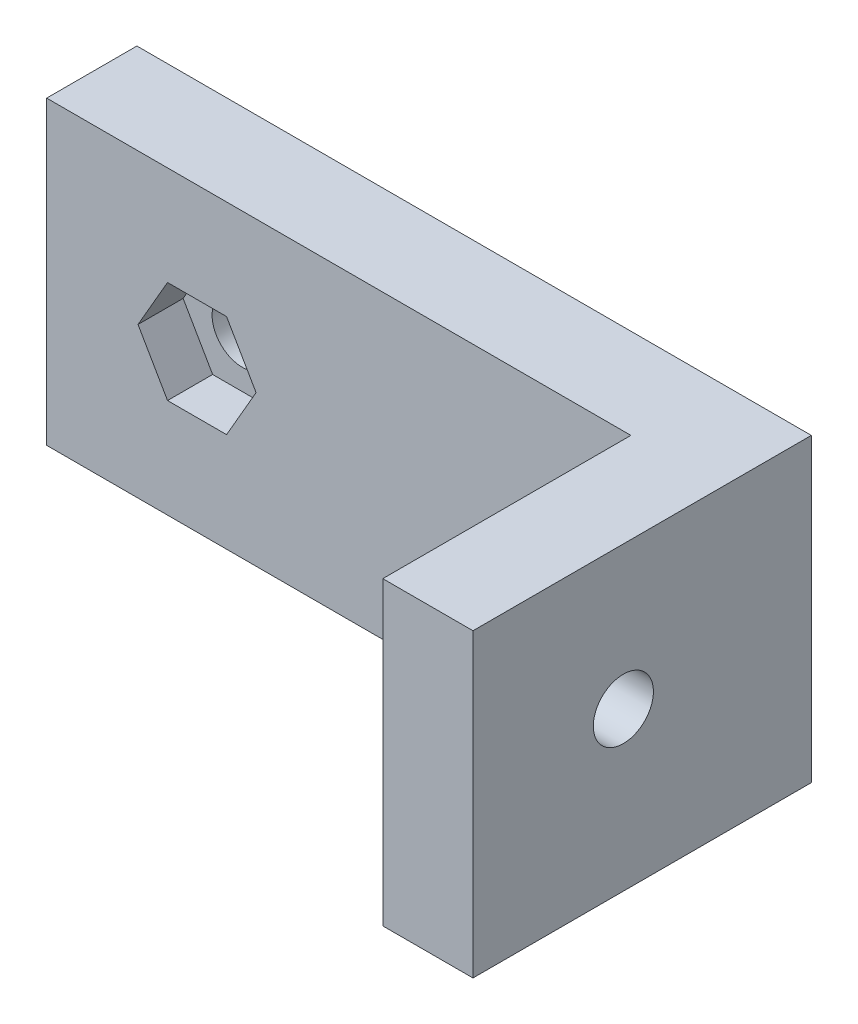
ISO-10303-21;
HEADER;
FILE_DESCRIPTION(('STEP AP214'),'2;1');
FILE_NAME('part.step','',(''),(''),'','','');
FILE_SCHEMA(('AUTOMOTIVE_DESIGN { 1 0 10303 214 1 1 1 1 }'));
ENDSEC;
DATA;
#1=APPLICATION_CONTEXT('core data for automotive mechanical design processes');
#2=APPLICATION_PROTOCOL_DEFINITION('international standard','automotive_design',2000,#1);
#3=PRODUCT_CONTEXT('',#1,'mechanical');
#4=PRODUCT('Part','Part','',(#3));
#5=PRODUCT_RELATED_PRODUCT_CATEGORY('part','',(#4));
#6=PRODUCT_DEFINITION_FORMATION('','',#4);
#7=PRODUCT_DEFINITION_CONTEXT('part definition',#1,'design');
#8=PRODUCT_DEFINITION('design','',#6,#7);
#9=PRODUCT_DEFINITION_SHAPE('','',#8);
#10=(LENGTH_UNIT() NAMED_UNIT(*) SI_UNIT(.MILLI.,.METRE.));
#11=(NAMED_UNIT(*) PLANE_ANGLE_UNIT() SI_UNIT($,.RADIAN.));
#12=(NAMED_UNIT(*) SI_UNIT($,.STERADIAN.) SOLID_ANGLE_UNIT());
#13=UNCERTAINTY_MEASURE_WITH_UNIT(LENGTH_MEASURE(1.E-05),#10,'distance_accuracy_value','');
#14=(GEOMETRIC_REPRESENTATION_CONTEXT(3) GLOBAL_UNCERTAINTY_ASSIGNED_CONTEXT((#13)) GLOBAL_UNIT_ASSIGNED_CONTEXT((#10,
#11,#12)) REPRESENTATION_CONTEXT('',''));
#15=CARTESIAN_POINT('',(0.,0.,0.));
#16=DIRECTION('',(0.,0.,1.));
#17=DIRECTION('',(1.,0.,0.));
#18=AXIS2_PLACEMENT_3D('',#15,#16,#17);
#19=CARTESIAN_POINT('',(166.699999999995,-1.0859269598204E-13,0.));
#20=DIRECTION('',(-1.,0.,0.));
#21=DIRECTION('',(0.,-1.,0.));
#22=AXIS2_PLACEMENT_3D('',#19,#20,#21);
#23=PLANE('',#22);
#24=CARTESIAN_POINT('',(166.699999999995,2.99999999999889,12.5000000000006));
#25=DIRECTION('',(-1.,0.,0.));
#26=DIRECTION('',(0.,-1.,0.));
#27=AXIS2_PLACEMENT_3D('',#24,#25,#26);
#28=CIRCLE('',#27,2.);
#29=CARTESIAN_POINT('',(166.699999999995,0.999999999998898,12.5000000000006));
#30=VERTEX_POINT('',#29);
#31=EDGE_CURVE('E291',#30,#30,#28,.F.);
#32=ORIENTED_EDGE('',*,*,#31,.T.);
#33=EDGE_LOOP('',(#32));
#34=FACE_BOUND('',#33,.T.);
#35=DIRECTION('',(0.,1.,0.));
#36=VECTOR('',#35,1.);
#37=CARTESIAN_POINT('',(166.699999999995,-1.0859269598204E-13,9.10000000000063));
#38=LINE('',#37,#36);
#39=CARTESIAN_POINT('',(166.699999999995,1.03700908475416,9.10000000000063));
#40=VERTEX_POINT('',#39);
#41=CARTESIAN_POINT('',(166.699999999995,4.96299091524362,9.10000000000063));
#42=VERTEX_POINT('',#41);
#43=EDGE_CURVE('E261',#40,#42,#38,.T.);
#44=ORIENTED_EDGE('',*,*,#43,.F.);
#45=DIRECTION('',(0.,0.5,-0.866025403784439));
#46=VECTOR('',#45,1.);
#47=CARTESIAN_POINT('',(166.699999999995,4.71817240078511,2.72403810567631));
#48=LINE('',#47,#46);
#49=CARTESIAN_POINT('',(166.699999999995,-0.925981830490564,12.5000000000006));
#50=VERTEX_POINT('',#49);
#51=EDGE_CURVE('E228',#50,#40,#48,.T.);
#52=ORIENTED_EDGE('',*,*,#51,.F.);
#53=DIRECTION('',(0.,-0.5,-0.866025403784439));
#54=VECTOR('',#53,1.);
#55=CARTESIAN_POINT('',(166.699999999995,-6.10714514652101,3.52596189432386));
#56=LINE('',#55,#54);
#57=CARTESIAN_POINT('',(166.699999999995,1.03700908475417,15.9000000000006));
#58=VERTEX_POINT('',#57);
#59=EDGE_CURVE('E247',#58,#50,#56,.T.);
#60=ORIENTED_EDGE('',*,*,#59,.F.);
#61=DIRECTION('',(0.,-1.,0.));
#62=VECTOR('',#61,1.);
#63=CARTESIAN_POINT('',(166.699999999995,-1.0859269598204E-13,15.9000000000006));
#64=LINE('',#63,#62);
#65=CARTESIAN_POINT('',(166.699999999995,4.96299091524362,15.9000000000006));
#66=VERTEX_POINT('',#65);
#67=EDGE_CURVE('E250',#66,#58,#64,.T.);
#68=ORIENTED_EDGE('',*,*,#67,.F.);
#69=DIRECTION('',(0.,-0.5,0.866025403784439));
#70=VECTOR('',#69,1.);
#71=CARTESIAN_POINT('',(166.699999999995,10.6071451465193,6.12403810567632));
#72=LINE('',#71,#70);
#73=CARTESIAN_POINT('',(166.699999999995,6.92598183048835,12.5000000000006));
#74=VERTEX_POINT('',#73);
#75=EDGE_CURVE('E266',#74,#66,#72,.T.);
#76=ORIENTED_EDGE('',*,*,#75,.F.);
#77=DIRECTION('',(0.,0.5,0.866025403784439));
#78=VECTOR('',#77,1.);
#79=CARTESIAN_POINT('',(166.699999999995,-0.218172400786824,0.125961894323861));
#80=LINE('',#79,#78);
#81=EDGE_CURVE('E263',#42,#74,#80,.T.);
#82=ORIENTED_EDGE('',*,*,#81,.F.);
#83=EDGE_LOOP('',(#44,#52,#60,#68,#76,#82));
#84=FACE_BOUND('',#83,.T.);
#85=ADVANCED_FACE('F97',(#34,#84),#23,.T.);
#86=CARTESIAN_POINT('',(0.,0.,6.));
#87=DIRECTION('',(0.,0.,1.));
#88=DIRECTION('',(1.,0.,0.));
#89=AXIS2_PLACEMENT_3D('',#86,#87,#88);
#90=PLANE('',#89);
#91=DIRECTION('',(0.,-1.,0.));
#92=VECTOR('',#91,1.);
#93=CARTESIAN_POINT('',(163.699999999995,-1.06549720020236E-13,6.));
#94=LINE('',#93,#92);
#95=CARTESIAN_POINT('',(163.699999999995,12.5000000000001,6.));
#96=VERTEX_POINT('',#95);
#97=CARTESIAN_POINT('',(163.699999999995,-7.49999999999993,6.));
#98=VERTEX_POINT('',#97);
#99=EDGE_CURVE('E116',#96,#98,#94,.T.);
#100=ORIENTED_EDGE('',*,*,#99,.F.);
#101=DIRECTION('',(1.,0.,0.));
#102=VECTOR('',#101,1.);
#103=CARTESIAN_POINT('',(0.,12.5,6.));
#104=LINE('',#103,#102);
#105=CARTESIAN_POINT('',(124.850000000005,12.5000000000001,6.));
#106=VERTEX_POINT('',#105);
#107=EDGE_CURVE('E362',#106,#96,#104,.T.);
#108=ORIENTED_EDGE('',*,*,#107,.F.);
#109=DIRECTION('',(0.,-1.,0.));
#110=VECTOR('',#109,1.);
#111=CARTESIAN_POINT('',(124.850000000005,0.,6.));
#112=LINE('',#111,#110);
#113=CARTESIAN_POINT('',(124.850000000005,-7.49999999999993,6.));
#114=VERTEX_POINT('',#113);
#115=EDGE_CURVE('E360',#106,#114,#112,.T.);
#116=ORIENTED_EDGE('',*,*,#115,.T.);
#117=DIRECTION('',(1.,0.,0.));
#118=VECTOR('',#117,1.);
#119=CARTESIAN_POINT('',(0.,-7.49999999999996,6.));
#120=LINE('',#119,#118);
#121=EDGE_CURVE('E112',#114,#98,#120,.T.);
#122=ORIENTED_EDGE('',*,*,#121,.T.);
#123=EDGE_LOOP('',(#100,#108,#116,#122));
#124=FACE_BOUND('',#123,.T.);
#125=DIRECTION('',(0.499999999999999,0.866025403784439,0.));
#126=VECTOR('',#125,1.);
#127=CARTESIAN_POINT('',(97.1104818724058,-56.0667628501677,6.));
#128=LINE('',#127,#126);
#129=CARTESIAN_POINT('',(130.924018169515,2.50000000000006,6.));
#130=VERTEX_POINT('',#129);
#131=CARTESIAN_POINT('',(132.88700908476,5.90000000000007,6.));
#132=VERTEX_POINT('',#131);
#133=EDGE_CURVE('E306',#130,#132,#128,.T.);
#134=ORIENTED_EDGE('',*,*,#133,.T.);
#135=DIRECTION('',(1.,0.,0.));
#136=VECTOR('',#135,1.);
#137=CARTESIAN_POINT('',(0.,5.90000000000007,6.));
#138=LINE('',#137,#136);
#139=CARTESIAN_POINT('',(136.812990915249,5.90000000000007,6.));
#140=VERTEX_POINT('',#139);
#141=EDGE_CURVE('E309',#132,#140,#138,.T.);
#142=ORIENTED_EDGE('',*,*,#141,.T.);
#143=DIRECTION('',(0.500000000000001,-0.866025403784438,0.));
#144=VECTOR('',#143,1.);
#145=CARTESIAN_POINT('',(105.164518127601,60.7167628501678,6.));
#146=LINE('',#145,#144);
#147=CARTESIAN_POINT('',(138.775981830494,2.50000000000005,6.));
#148=VERTEX_POINT('',#147);
#149=EDGE_CURVE('E313',#140,#148,#146,.T.);
#150=ORIENTED_EDGE('',*,*,#149,.T.);
#151=DIRECTION('',(-0.500000000000003,-0.866025403784437,0.));
#152=VECTOR('',#151,1.);
#153=CARTESIAN_POINT('',(102.999454618139,-59.466762850168,6.));
#154=LINE('',#153,#152);
#155=CARTESIAN_POINT('',(136.812990915249,-0.89999999999993,6.));
#156=VERTEX_POINT('',#155);
#157=EDGE_CURVE('E316',#148,#156,#154,.T.);
#158=ORIENTED_EDGE('',*,*,#157,.T.);
#159=DIRECTION('',(-1.,0.,0.));
#160=VECTOR('',#159,1.);
#161=CARTESIAN_POINT('',(0.,-0.899999999999915,6.));
#162=LINE('',#161,#160);
#163=CARTESIAN_POINT('',(132.88700908476,-0.899999999999929,6.));
#164=VERTEX_POINT('',#163);
#165=EDGE_CURVE('E319',#156,#164,#162,.T.);
#166=ORIENTED_EDGE('',*,*,#165,.T.);
#167=DIRECTION('',(-0.499999999999994,0.866025403784442,0.));
#168=VECTOR('',#167,1.);
#169=CARTESIAN_POINT('',(99.2755453818676,57.3167628501673,6.));
#170=LINE('',#169,#168);
#171=EDGE_CURVE('E322',#164,#130,#170,.T.);
#172=ORIENTED_EDGE('',*,*,#171,.T.);
#173=EDGE_LOOP('',(#134,#142,#150,#158,#166,#172));
#174=FACE_BOUND('',#173,.T.);
#175=ADVANCED_FACE('F420',(#124,#174),#90,.T.);
#176=CARTESIAN_POINT('',(124.850000000005,0.,3.));
#177=DIRECTION('',(-1.,0.,0.));
#178=DIRECTION('',(0.,0.,1.));
#179=AXIS2_PLACEMENT_3D('',#176,#177,#178);
#180=PLANE('',#179);
#181=DIRECTION('',(0.,1.,0.));
#182=VECTOR('',#181,1.);
#183=CARTESIAN_POINT('',(124.850000000005,0.,0.));
#184=LINE('',#183,#182);
#185=CARTESIAN_POINT('',(124.850000000005,-7.49999999999993,0.));
#186=VERTEX_POINT('',#185);
#187=CARTESIAN_POINT('',(124.850000000005,12.5000000000001,0.));
#188=VERTEX_POINT('',#187);
#189=EDGE_CURVE('E364',#186,#188,#184,.T.);
#190=ORIENTED_EDGE('',*,*,#189,.F.);
#191=DIRECTION('',(0.,0.,-1.));
#192=VECTOR('',#191,1.);
#193=CARTESIAN_POINT('',(124.850000000005,-7.49999999999993,3.));
#194=LINE('',#193,#192);
#195=EDGE_CURVE('E12',#114,#186,#194,.T.);
#196=ORIENTED_EDGE('',*,*,#195,.F.);
#197=ORIENTED_EDGE('',*,*,#115,.F.);
#198=DIRECTION('',(0.,0.,-1.));
#199=VECTOR('',#198,1.);
#200=CARTESIAN_POINT('',(124.850000000005,12.5000000000001,3.));
#201=LINE('',#200,#199);
#202=EDGE_CURVE('E368',#106,#188,#201,.T.);
#203=ORIENTED_EDGE('',*,*,#202,.T.);
#204=EDGE_LOOP('',(#190,#196,#197,#203));
#205=FACE_BOUND('',#204,.T.);
#206=ADVANCED_FACE('F99',(#205),#180,.T.);
#207=CARTESIAN_POINT('',(0.,-7.49999999999996,3.));
#208=DIRECTION('',(0.,-1.,0.));
#209=DIRECTION('',(1.,0.,0.));
#210=AXIS2_PLACEMENT_3D('',#207,#208,#209);
#211=PLANE('',#210);
#212=DIRECTION('',(-1.,0.,0.));
#213=VECTOR('',#212,1.);
#214=CARTESIAN_POINT('',(0.,-7.49999999999996,0.));
#215=LINE('',#214,#213);
#216=CARTESIAN_POINT('',(169.699999999995,-7.49999999999992,0.));
#217=VERTEX_POINT('',#216);
#218=EDGE_CURVE('E372',#217,#186,#215,.T.);
#219=ORIENTED_EDGE('',*,*,#218,.F.);
#220=DIRECTION('',(0.,0.,-1.));
#221=VECTOR('',#220,1.);
#222=CARTESIAN_POINT('',(169.699999999995,-7.49999999999992,3.));
#223=LINE('',#222,#221);
#224=CARTESIAN_POINT('',(169.699999999995,-7.49999999999991,22.5000000000006));
#225=VERTEX_POINT('',#224);
#226=EDGE_CURVE('E105',#225,#217,#223,.T.);
#227=ORIENTED_EDGE('',*,*,#226,.F.);
#228=DIRECTION('',(1.,0.,0.));
#229=VECTOR('',#228,1.);
#230=CARTESIAN_POINT('',(166.699999999995,-7.49999999999991,22.5000000000006));
#231=LINE('',#230,#229);
#232=CARTESIAN_POINT('',(163.699999999995,-7.49999999999991,22.5000000000006));
#233=VERTEX_POINT('',#232);
#234=EDGE_CURVE('E302',#233,#225,#231,.T.);
#235=ORIENTED_EDGE('',*,*,#234,.F.);
#236=DIRECTION('',(0.,0.,-1.));
#237=VECTOR('',#236,1.);
#238=CARTESIAN_POINT('',(163.699999999995,-7.49999999999991,0.));
#239=LINE('',#238,#237);
#240=EDGE_CURVE('E284',#233,#98,#239,.T.);
#241=ORIENTED_EDGE('',*,*,#240,.T.);
#242=ORIENTED_EDGE('',*,*,#121,.F.);
#243=ORIENTED_EDGE('',*,*,#195,.T.);
#244=EDGE_LOOP('',(#219,#227,#235,#241,#242,#243));
#245=FACE_BOUND('',#244,.T.);
#246=ADVANCED_FACE('F396',(#245),#211,.T.);
#247=CARTESIAN_POINT('',(169.699999999995,0.,3.));
#248=DIRECTION('',(-1.,0.,0.));
#249=DIRECTION('',(0.,0.,1.));
#250=AXIS2_PLACEMENT_3D('',#247,#248,#249);
#251=PLANE('',#250);
#252=DIRECTION('',(0.,1.,0.));
#253=VECTOR('',#252,1.);
#254=CARTESIAN_POINT('',(169.699999999995,0.,0.));
#255=LINE('',#254,#253);
#256=CARTESIAN_POINT('',(169.699999999995,12.5000000000001,0.));
#257=VERTEX_POINT('',#256);
#258=EDGE_CURVE('E375',#217,#257,#255,.T.);
#259=ORIENTED_EDGE('',*,*,#258,.T.);
#260=DIRECTION('',(0.,0.,-1.));
#261=VECTOR('',#260,1.);
#262=CARTESIAN_POINT('',(169.699999999995,12.5000000000001,3.));
#263=LINE('',#262,#261);
#264=CARTESIAN_POINT('',(169.699999999995,12.5000000000001,22.5000000000006));
#265=VERTEX_POINT('',#264);
#266=EDGE_CURVE('E383',#265,#257,#263,.T.);
#267=ORIENTED_EDGE('',*,*,#266,.F.);
#268=DIRECTION('',(0.,1.,0.));
#269=VECTOR('',#268,1.);
#270=CARTESIAN_POINT('',(169.699999999995,-1.10635671943845E-13,22.5000000000006));
#271=LINE('',#270,#269);
#272=EDGE_CURVE('E290',#225,#265,#271,.T.);
#273=ORIENTED_EDGE('',*,*,#272,.F.);
#274=ORIENTED_EDGE('',*,*,#226,.T.);
#275=EDGE_LOOP('',(#259,#267,#273,#274));
#276=FACE_BOUND('',#275,.T.);
#277=CARTESIAN_POINT('',(169.699999999995,2.99999999999889,12.5000000000006));
#278=DIRECTION('',(-1.,0.,0.));
#279=DIRECTION('',(0.,-1.,0.));
#280=AXIS2_PLACEMENT_3D('',#277,#278,#279);
#281=CIRCLE('',#280,2.);
#282=CARTESIAN_POINT('',(169.699999999995,0.999999999998896,12.5000000000006));
#283=VERTEX_POINT('',#282);
#284=EDGE_CURVE('E295',#283,#283,#281,.F.);
#285=ORIENTED_EDGE('',*,*,#284,.F.);
#286=EDGE_LOOP('',(#285));
#287=FACE_BOUND('',#286,.T.);
#288=ADVANCED_FACE('F388',(#276,#287),#251,.F.);
#289=CARTESIAN_POINT('',(0.,12.5,3.));
#290=DIRECTION('',(0.,-1.,0.));
#291=DIRECTION('',(1.,0.,0.));
#292=AXIS2_PLACEMENT_3D('',#289,#290,#291);
#293=PLANE('',#292);
#294=DIRECTION('',(-1.,0.,0.));
#295=VECTOR('',#294,1.);
#296=CARTESIAN_POINT('',(0.,12.5,0.));
#297=LINE('',#296,#295);
#298=EDGE_CURVE('E377',#257,#188,#297,.T.);
#299=ORIENTED_EDGE('',*,*,#298,.T.);
#300=ORIENTED_EDGE('',*,*,#202,.F.);
#301=ORIENTED_EDGE('',*,*,#107,.T.);
#302=DIRECTION('',(0.,0.,-1.));
#303=VECTOR('',#302,1.);
#304=CARTESIAN_POINT('',(163.699999999995,12.5000000000001,0.));
#305=LINE('',#304,#303);
#306=CARTESIAN_POINT('',(163.699999999995,12.5000000000001,22.5000000000006));
#307=VERTEX_POINT('',#306);
#308=EDGE_CURVE('E273',#307,#96,#305,.T.);
#309=ORIENTED_EDGE('',*,*,#308,.F.);
#310=DIRECTION('',(1.,0.,0.));
#311=VECTOR('',#310,1.);
#312=CARTESIAN_POINT('',(166.699999999995,12.5000000000001,22.5000000000006));
#313=LINE('',#312,#311);
#314=EDGE_CURVE('E294',#307,#265,#313,.T.);
#315=ORIENTED_EDGE('',*,*,#314,.T.);
#316=ORIENTED_EDGE('',*,*,#266,.T.);
#317=EDGE_LOOP('',(#299,#300,#301,#309,#315,#316));
#318=FACE_BOUND('',#317,.T.);
#319=ADVANCED_FACE('F401',(#318),#293,.F.);
#320=CARTESIAN_POINT('',(134.850000000005,2.50000000000007,3.));
#321=DIRECTION('',(0.,0.,-1.));
#322=DIRECTION('',(-1.,0.,0.));
#323=AXIS2_PLACEMENT_3D('',#320,#321,#322);
#324=CYLINDRICAL_SURFACE('',#323,2.);
#325=CARTESIAN_POINT('',(134.850000000005,2.50000000000007,3.));
#326=DIRECTION('',(0.,0.,1.));
#327=DIRECTION('',(1.,0.,0.));
#328=AXIS2_PLACEMENT_3D('',#325,#326,#327);
#329=CIRCLE('',#328,2.);
#330=CARTESIAN_POINT('',(136.850000000005,2.50000000000007,3.));
#331=VERTEX_POINT('',#330);
#332=EDGE_CURVE('E365',#331,#331,#329,.T.);
#333=ORIENTED_EDGE('',*,*,#332,.T.);
#334=EDGE_LOOP('',(#333));
#335=FACE_BOUND('',#334,.T.);
#336=CARTESIAN_POINT('',(134.850000000005,2.50000000000007,0.));
#337=DIRECTION('',(0.,0.,1.));
#338=DIRECTION('',(1.,0.,0.));
#339=AXIS2_PLACEMENT_3D('',#336,#337,#338);
#340=CIRCLE('',#339,2.);
#341=CARTESIAN_POINT('',(136.850000000005,2.50000000000007,0.));
#342=VERTEX_POINT('',#341);
#343=EDGE_CURVE('E369',#342,#342,#340,.T.);
#344=ORIENTED_EDGE('',*,*,#343,.F.);
#345=EDGE_LOOP('',(#344));
#346=FACE_BOUND('',#345,.T.);
#347=ADVANCED_FACE('F457',(#335,#346),#324,.F.);
#348=CARTESIAN_POINT('',(0.,0.,3.));
#349=DIRECTION('',(0.,0.,1.));
#350=DIRECTION('',(1.,0.,0.));
#351=AXIS2_PLACEMENT_3D('',#348,#349,#350);
#352=PLANE('',#351);
#353=DIRECTION('',(1.,0.,0.));
#354=VECTOR('',#353,1.);
#355=CARTESIAN_POINT('',(0.,5.90000000000007,3.));
#356=LINE('',#355,#354);
#357=CARTESIAN_POINT('',(132.88700908476,5.90000000000007,3.));
#358=VERTEX_POINT('',#357);
#359=CARTESIAN_POINT('',(136.812990915249,5.90000000000004,3.));
#360=VERTEX_POINT('',#359);
#361=EDGE_CURVE('E328',#358,#360,#356,.T.);
#362=ORIENTED_EDGE('',*,*,#361,.F.);
#363=DIRECTION('',(0.499999999999999,0.866025403784439,0.));
#364=VECTOR('',#363,1.);
#365=CARTESIAN_POINT('',(97.1104818724058,-56.0667628501677,3.));
#366=LINE('',#365,#364);
#367=CARTESIAN_POINT('',(130.924018169515,2.50000000000006,3.));
#368=VERTEX_POINT('',#367);
#369=EDGE_CURVE('E305',#368,#358,#366,.T.);
#370=ORIENTED_EDGE('',*,*,#369,.F.);
#371=DIRECTION('',(-0.499999999999994,0.866025403784442,0.));
#372=VECTOR('',#371,1.);
#373=CARTESIAN_POINT('',(99.2755453818676,57.3167628501673,3.));
#374=LINE('',#373,#372);
#375=CARTESIAN_POINT('',(132.88700908476,-0.899999999999929,3.));
#376=VERTEX_POINT('',#375);
#377=EDGE_CURVE('E310',#376,#368,#374,.T.);
#378=ORIENTED_EDGE('',*,*,#377,.F.);
#379=DIRECTION('',(-1.,0.,0.));
#380=VECTOR('',#379,1.);
#381=CARTESIAN_POINT('',(0.,-0.899999999999915,3.));
#382=LINE('',#381,#380);
#383=CARTESIAN_POINT('',(136.812990915249,-0.89999999999993,3.));
#384=VERTEX_POINT('',#383);
#385=EDGE_CURVE('E337',#384,#376,#382,.T.);
#386=ORIENTED_EDGE('',*,*,#385,.F.);
#387=DIRECTION('',(-0.500000000000003,-0.866025403784437,0.));
#388=VECTOR('',#387,1.);
#389=CARTESIAN_POINT('',(102.999454618139,-59.466762850168,3.));
#390=LINE('',#389,#388);
#391=CARTESIAN_POINT('',(138.775981830494,2.50000000000005,3.));
#392=VERTEX_POINT('',#391);
#393=EDGE_CURVE('E334',#392,#384,#390,.T.);
#394=ORIENTED_EDGE('',*,*,#393,.F.);
#395=DIRECTION('',(0.500000000000001,-0.866025403784438,0.));
#396=VECTOR('',#395,1.);
#397=CARTESIAN_POINT('',(105.164518127601,60.7167628501678,3.));
#398=LINE('',#397,#396);
#399=EDGE_CURVE('E331',#360,#392,#398,.T.);
#400=ORIENTED_EDGE('',*,*,#399,.F.);
#401=EDGE_LOOP('',(#362,#370,#378,#386,#394,#400));
#402=FACE_BOUND('',#401,.T.);
#403=ORIENTED_EDGE('',*,*,#332,.F.);
#404=EDGE_LOOP('',(#403));
#405=FACE_BOUND('',#404,.T.);
#406=ADVANCED_FACE('F454',(#402,#405),#352,.T.);
#407=CARTESIAN_POINT('',(0.,0.,0.));
#408=DIRECTION('',(0.,0.,1.));
#409=DIRECTION('',(1.,0.,0.));
#410=AXIS2_PLACEMENT_3D('',#407,#408,#409);
#411=PLANE('',#410);
#412=ORIENTED_EDGE('',*,*,#189,.T.);
#413=ORIENTED_EDGE('',*,*,#298,.F.);
#414=ORIENTED_EDGE('',*,*,#258,.F.);
#415=ORIENTED_EDGE('',*,*,#218,.T.);
#416=EDGE_LOOP('',(#412,#413,#414,#415));
#417=FACE_BOUND('',#416,.T.);
#418=ORIENTED_EDGE('',*,*,#343,.T.);
#419=EDGE_LOOP('',(#418));
#420=FACE_BOUND('',#419,.T.);
#421=ADVANCED_FACE('F394',(#417,#420),#411,.F.);
#422=CARTESIAN_POINT('',(97.1104818724058,-56.0667628501677,6.));
#423=DIRECTION('',(-0.866025403784439,0.499999999999999,0.));
#424=DIRECTION('',(-0.499999999999999,-0.866025403784439,0.));
#425=AXIS2_PLACEMENT_3D('',#422,#423,#424);
#426=PLANE('',#425);
#427=ORIENTED_EDGE('',*,*,#369,.T.);
#428=DIRECTION('',(0.,0.,-1.));
#429=VECTOR('',#428,1.);
#430=CARTESIAN_POINT('',(132.88700908476,5.90000000000007,6.));
#431=LINE('',#430,#429);
#432=EDGE_CURVE('E325',#132,#358,#431,.T.);
#433=ORIENTED_EDGE('',*,*,#432,.F.);
#434=ORIENTED_EDGE('',*,*,#133,.F.);
#435=DIRECTION('',(0.,0.,-1.));
#436=VECTOR('',#435,1.);
#437=CARTESIAN_POINT('',(130.924018169515,2.50000000000006,6.));
#438=LINE('',#437,#436);
#439=EDGE_CURVE('E342',#130,#368,#438,.T.);
#440=ORIENTED_EDGE('',*,*,#439,.T.);
#441=EDGE_LOOP('',(#427,#433,#434,#440));
#442=FACE_BOUND('',#441,.T.);
#443=ADVANCED_FACE('F435',(#442),#426,.F.);
#444=CARTESIAN_POINT('',(99.2755453818676,57.3167628501673,6.));
#445=DIRECTION('',(-0.866025403784442,-0.499999999999994,0.));
#446=DIRECTION('',(0.499999999999994,-0.866025403784442,0.));
#447=AXIS2_PLACEMENT_3D('',#444,#445,#446);
#448=PLANE('',#447);
#449=ORIENTED_EDGE('',*,*,#377,.T.);
#450=ORIENTED_EDGE('',*,*,#439,.F.);
#451=ORIENTED_EDGE('',*,*,#171,.F.);
#452=DIRECTION('',(0.,0.,-1.));
#453=VECTOR('',#452,1.);
#454=CARTESIAN_POINT('',(132.88700908476,-0.899999999999929,6.));
#455=LINE('',#454,#453);
#456=EDGE_CURVE('E345',#164,#376,#455,.T.);
#457=ORIENTED_EDGE('',*,*,#456,.T.);
#458=EDGE_LOOP('',(#449,#450,#451,#457));
#459=FACE_BOUND('',#458,.T.);
#460=ADVANCED_FACE('F431',(#459),#448,.F.);
#461=CARTESIAN_POINT('',(0.,-0.899999999999915,6.));
#462=DIRECTION('',(0.,-1.,0.));
#463=DIRECTION('',(1.,0.,0.));
#464=AXIS2_PLACEMENT_3D('',#461,#462,#463);
#465=PLANE('',#464);
#466=ORIENTED_EDGE('',*,*,#385,.T.);
#467=ORIENTED_EDGE('',*,*,#456,.F.);
#468=ORIENTED_EDGE('',*,*,#165,.F.);
#469=DIRECTION('',(0.,0.,-1.));
#470=VECTOR('',#469,1.);
#471=CARTESIAN_POINT('',(136.812990915249,-0.89999999999993,6.));
#472=LINE('',#471,#470);
#473=EDGE_CURVE('E348',#156,#384,#472,.T.);
#474=ORIENTED_EDGE('',*,*,#473,.T.);
#475=EDGE_LOOP('',(#466,#467,#468,#474));
#476=FACE_BOUND('',#475,.T.);
#477=ADVANCED_FACE('F434',(#476),#465,.F.);
#478=CARTESIAN_POINT('',(102.999454618139,-59.466762850168,6.));
#479=DIRECTION('',(0.866025403784437,-0.500000000000003,0.));
#480=DIRECTION('',(0.500000000000004,0.866025403784437,0.));
#481=AXIS2_PLACEMENT_3D('',#478,#479,#480);
#482=PLANE('',#481);
#483=ORIENTED_EDGE('',*,*,#393,.T.);
#484=ORIENTED_EDGE('',*,*,#473,.F.);
#485=ORIENTED_EDGE('',*,*,#157,.F.);
#486=DIRECTION('',(0.,0.,-1.));
#487=VECTOR('',#486,1.);
#488=CARTESIAN_POINT('',(138.775981830494,2.50000000000005,6.));
#489=LINE('',#488,#487);
#490=EDGE_CURVE('E351',#148,#392,#489,.T.);
#491=ORIENTED_EDGE('',*,*,#490,.T.);
#492=EDGE_LOOP('',(#483,#484,#485,#491));
#493=FACE_BOUND('',#492,.T.);
#494=ADVANCED_FACE('F439',(#493),#482,.F.);
#495=CARTESIAN_POINT('',(105.164518127601,60.7167628501678,6.));
#496=DIRECTION('',(0.866025403784438,0.500000000000001,0.));
#497=DIRECTION('',(-0.500000000000001,0.866025403784438,0.));
#498=AXIS2_PLACEMENT_3D('',#495,#496,#497);
#499=PLANE('',#498);
#500=ORIENTED_EDGE('',*,*,#399,.T.);
#501=ORIENTED_EDGE('',*,*,#490,.F.);
#502=ORIENTED_EDGE('',*,*,#149,.F.);
#503=DIRECTION('',(0.,0.,-1.));
#504=VECTOR('',#503,1.);
#505=CARTESIAN_POINT('',(136.812990915249,5.90000000000004,6.));
#506=LINE('',#505,#504);
#507=EDGE_CURVE('E354',#140,#360,#506,.T.);
#508=ORIENTED_EDGE('',*,*,#507,.T.);
#509=EDGE_LOOP('',(#500,#501,#502,#508));
#510=FACE_BOUND('',#509,.T.);
#511=ADVANCED_FACE('F443',(#510),#499,.F.);
#512=CARTESIAN_POINT('',(0.,5.90000000000007,6.));
#513=DIRECTION('',(0.,1.,0.));
#514=DIRECTION('',(0.,0.,1.));
#515=AXIS2_PLACEMENT_3D('',#512,#513,#514);
#516=PLANE('',#515);
#517=ORIENTED_EDGE('',*,*,#361,.T.);
#518=ORIENTED_EDGE('',*,*,#507,.F.);
#519=ORIENTED_EDGE('',*,*,#141,.F.);
#520=ORIENTED_EDGE('',*,*,#432,.T.);
#521=EDGE_LOOP('',(#517,#518,#519,#520));
#522=FACE_BOUND('',#521,.T.);
#523=ADVANCED_FACE('F430',(#522),#516,.F.);
#524=CARTESIAN_POINT('',(166.699999999995,-1.0859269598204E-13,22.5000000000006));
#525=DIRECTION('',(0.,0.,-1.));
#526=DIRECTION('',(-1.,0.,0.));
#527=AXIS2_PLACEMENT_3D('',#524,#525,#526);
#528=PLANE('',#527);
#529=ORIENTED_EDGE('',*,*,#272,.T.);
#530=ORIENTED_EDGE('',*,*,#314,.F.);
#531=DIRECTION('',(0.,-1.,0.));
#532=VECTOR('',#531,1.);
#533=CARTESIAN_POINT('',(163.699999999995,-1.06549720020236E-13,22.5000000000006));
#534=LINE('',#533,#532);
#535=EDGE_CURVE('E287',#307,#233,#534,.T.);
#536=ORIENTED_EDGE('',*,*,#535,.T.);
#537=ORIENTED_EDGE('',*,*,#234,.T.);
#538=EDGE_LOOP('',(#529,#530,#536,#537));
#539=FACE_BOUND('',#538,.T.);
#540=ADVANCED_FACE('F405',(#539),#528,.F.);
#541=CARTESIAN_POINT('',(166.699999999995,2.99999999999889,12.5000000000006));
#542=DIRECTION('',(1.,0.,0.));
#543=DIRECTION('',(0.,1.,0.));
#544=AXIS2_PLACEMENT_3D('',#541,#542,#543);
#545=CYLINDRICAL_SURFACE('',#544,2.);
#546=ORIENTED_EDGE('',*,*,#31,.F.);
#547=EDGE_LOOP('',(#546));
#548=FACE_BOUND('',#547,.T.);
#549=ORIENTED_EDGE('',*,*,#284,.T.);
#550=EDGE_LOOP('',(#549));
#551=FACE_BOUND('',#550,.T.);
#552=ADVANCED_FACE('F408',(#548,#551),#545,.F.);
#553=CARTESIAN_POINT('',(163.699999999995,-1.06636850278849E-13,0.));
#554=DIRECTION('',(-1.,0.,0.));
#555=DIRECTION('',(0.,-1.,0.));
#556=AXIS2_PLACEMENT_3D('',#553,#554,#555);
#557=PLANE('',#556);
#558=DIRECTION('',(0.,0.5,-0.866025403784439));
#559=VECTOR('',#558,1.);
#560=CARTESIAN_POINT('',(163.699999999995,4.71817240078511,2.72403810567631));
#561=LINE('',#560,#559);
#562=CARTESIAN_POINT('',(163.699999999995,-0.925981830490562,12.5000000000006));
#563=VERTEX_POINT('',#562);
#564=CARTESIAN_POINT('',(163.699999999995,1.03700908475417,9.10000000000063));
#565=VERTEX_POINT('',#564);
#566=EDGE_CURVE('E225',#563,#565,#561,.T.);
#567=ORIENTED_EDGE('',*,*,#566,.T.);
#568=DIRECTION('',(0.,1.,0.));
#569=VECTOR('',#568,1.);
#570=CARTESIAN_POINT('',(163.699999999995,-1.06549720020236E-13,9.10000000000063));
#571=LINE('',#570,#569);
#572=CARTESIAN_POINT('',(163.699999999995,4.96299091524362,9.10000000000063));
#573=VERTEX_POINT('',#572);
#574=EDGE_CURVE('E237',#565,#573,#571,.T.);
#575=ORIENTED_EDGE('',*,*,#574,.T.);
#576=DIRECTION('',(0.,0.5,0.866025403784439));
#577=VECTOR('',#576,1.);
#578=CARTESIAN_POINT('',(163.699999999995,-0.218172400786822,0.125961894323863));
#579=LINE('',#578,#577);
#580=CARTESIAN_POINT('',(163.699999999995,6.92598183048835,12.5000000000006));
#581=VERTEX_POINT('',#580);
#582=EDGE_CURVE('E241',#573,#581,#579,.T.);
#583=ORIENTED_EDGE('',*,*,#582,.T.);
#584=DIRECTION('',(0.,-0.5,0.866025403784439));
#585=VECTOR('',#584,1.);
#586=CARTESIAN_POINT('',(163.699999999995,10.6071451465193,6.12403810567632));
#587=LINE('',#586,#585);
#588=CARTESIAN_POINT('',(163.699999999995,4.96299091524362,15.9000000000006));
#589=VERTEX_POINT('',#588);
#590=EDGE_CURVE('E254',#581,#589,#587,.T.);
#591=ORIENTED_EDGE('',*,*,#590,.T.);
#592=DIRECTION('',(0.,-1.,0.));
#593=VECTOR('',#592,1.);
#594=CARTESIAN_POINT('',(163.699999999995,-1.06549720020236E-13,15.9000000000006));
#595=LINE('',#594,#593);
#596=CARTESIAN_POINT('',(163.699999999995,1.03700908475417,15.9000000000006));
#597=VERTEX_POINT('',#596);
#598=EDGE_CURVE('E257',#589,#597,#595,.T.);
#599=ORIENTED_EDGE('',*,*,#598,.T.);
#600=DIRECTION('',(0.,-0.5,-0.866025403784439));
#601=VECTOR('',#600,1.);
#602=CARTESIAN_POINT('',(163.699999999995,-6.10714514652101,3.52596189432387));
#603=LINE('',#602,#601);
#604=EDGE_CURVE('E233',#597,#563,#603,.T.);
#605=ORIENTED_EDGE('',*,*,#604,.T.);
#606=EDGE_LOOP('',(#567,#575,#583,#591,#599,#605));
#607=FACE_BOUND('',#606,.T.);
#608=ORIENTED_EDGE('',*,*,#308,.T.);
#609=ORIENTED_EDGE('',*,*,#99,.T.);
#610=ORIENTED_EDGE('',*,*,#240,.F.);
#611=ORIENTED_EDGE('',*,*,#535,.F.);
#612=EDGE_LOOP('',(#608,#609,#610,#611));
#613=FACE_BOUND('',#612,.T.);
#614=ADVANCED_FACE('F243',(#607,#613),#557,.T.);
#615=CARTESIAN_POINT('',(163.699999999995,4.71817240078511,2.72403810567631));
#616=DIRECTION('',(0.,-0.866025403784439,-0.5));
#617=DIRECTION('',(0.,0.5,-0.866025403784439));
#618=AXIS2_PLACEMENT_3D('',#615,#616,#617);
#619=PLANE('',#618);
#620=ORIENTED_EDGE('',*,*,#51,.T.);
#621=DIRECTION('',(1.,0.,0.));
#622=VECTOR('',#621,1.);
#623=CARTESIAN_POINT('',(163.699999999995,1.03700908475417,9.10000000000063));
#624=LINE('',#623,#622);
#625=EDGE_CURVE('E221',#565,#40,#624,.T.);
#626=ORIENTED_EDGE('',*,*,#625,.F.);
#627=ORIENTED_EDGE('',*,*,#566,.F.);
#628=DIRECTION('',(1.,0.,0.));
#629=VECTOR('',#628,1.);
#630=CARTESIAN_POINT('',(163.699999999995,-0.925981830490562,12.5000000000006));
#631=LINE('',#630,#629);
#632=EDGE_CURVE('E271',#563,#50,#631,.T.);
#633=ORIENTED_EDGE('',*,*,#632,.T.);
#634=EDGE_LOOP('',(#620,#626,#627,#633));
#635=FACE_BOUND('',#634,.T.);
#636=ADVANCED_FACE('F223',(#635),#619,.F.);
#637=CARTESIAN_POINT('',(163.699999999995,-6.10714514652101,3.52596189432387));
#638=DIRECTION('',(0.,-0.866025403784439,0.5));
#639=DIRECTION('',(0.,-0.5,-0.866025403784439));
#640=AXIS2_PLACEMENT_3D('',#637,#638,#639);
#641=PLANE('',#640);
#642=ORIENTED_EDGE('',*,*,#59,.T.);
#643=ORIENTED_EDGE('',*,*,#632,.F.);
#644=ORIENTED_EDGE('',*,*,#604,.F.);
#645=DIRECTION('',(1.,0.,0.));
#646=VECTOR('',#645,1.);
#647=CARTESIAN_POINT('',(163.699999999995,1.03700908475417,15.9000000000006));
#648=LINE('',#647,#646);
#649=EDGE_CURVE('E274',#597,#58,#648,.T.);
#650=ORIENTED_EDGE('',*,*,#649,.T.);
#651=EDGE_LOOP('',(#642,#643,#644,#650));
#652=FACE_BOUND('',#651,.T.);
#653=ADVANCED_FACE('F414',(#652),#641,.F.);
#654=CARTESIAN_POINT('',(163.699999999995,-1.06549720020236E-13,15.9000000000006));
#655=DIRECTION('',(0.,0.,1.));
#656=DIRECTION('',(1.,0.,0.));
#657=AXIS2_PLACEMENT_3D('',#654,#655,#656);
#658=PLANE('',#657);
#659=ORIENTED_EDGE('',*,*,#67,.T.);
#660=ORIENTED_EDGE('',*,*,#649,.F.);
#661=ORIENTED_EDGE('',*,*,#598,.F.);
#662=DIRECTION('',(1.,0.,0.));
#663=VECTOR('',#662,1.);
#664=CARTESIAN_POINT('',(163.699999999995,4.96299091524362,15.9000000000006));
#665=LINE('',#664,#663);
#666=EDGE_CURVE('E276',#589,#66,#665,.T.);
#667=ORIENTED_EDGE('',*,*,#666,.T.);
#668=EDGE_LOOP('',(#659,#660,#661,#667));
#669=FACE_BOUND('',#668,.T.);
#670=ADVANCED_FACE('F521',(#669),#658,.F.);
#671=CARTESIAN_POINT('',(163.699999999995,10.6071451465193,6.12403810567632));
#672=DIRECTION('',(0.,0.866025403784439,0.5));
#673=DIRECTION('',(0.,-0.5,0.866025403784439));
#674=AXIS2_PLACEMENT_3D('',#671,#672,#673);
#675=PLANE('',#674);
#676=ORIENTED_EDGE('',*,*,#75,.T.);
#677=ORIENTED_EDGE('',*,*,#666,.F.);
#678=ORIENTED_EDGE('',*,*,#590,.F.);
#679=DIRECTION('',(1.,0.,0.));
#680=VECTOR('',#679,1.);
#681=CARTESIAN_POINT('',(163.699999999995,6.92598183048835,12.5000000000006));
#682=LINE('',#681,#680);
#683=EDGE_CURVE('E278',#581,#74,#682,.T.);
#684=ORIENTED_EDGE('',*,*,#683,.T.);
#685=EDGE_LOOP('',(#676,#677,#678,#684));
#686=FACE_BOUND('',#685,.T.);
#687=ADVANCED_FACE('F531',(#686),#675,.F.);
#688=CARTESIAN_POINT('',(163.699999999995,-0.218172400786822,0.125961894323863));
#689=DIRECTION('',(0.,0.866025403784439,-0.5));
#690=DIRECTION('',(0.,0.5,0.866025403784439));
#691=AXIS2_PLACEMENT_3D('',#688,#689,#690);
#692=PLANE('',#691);
#693=ORIENTED_EDGE('',*,*,#81,.T.);
#694=ORIENTED_EDGE('',*,*,#683,.F.);
#695=ORIENTED_EDGE('',*,*,#582,.F.);
#696=DIRECTION('',(1.,0.,0.));
#697=VECTOR('',#696,1.);
#698=CARTESIAN_POINT('',(163.699999999995,4.96299091524362,9.10000000000063));
#699=LINE('',#698,#697);
#700=EDGE_CURVE('E232',#573,#42,#699,.T.);
#701=ORIENTED_EDGE('',*,*,#700,.T.);
#702=EDGE_LOOP('',(#693,#694,#695,#701));
#703=FACE_BOUND('',#702,.T.);
#704=ADVANCED_FACE('F541',(#703),#692,.F.);
#705=CARTESIAN_POINT('',(163.699999999995,-1.06549720020236E-13,9.10000000000063));
#706=DIRECTION('',(0.,0.,-1.));
#707=DIRECTION('',(-1.,0.,0.));
#708=AXIS2_PLACEMENT_3D('',#705,#706,#707);
#709=PLANE('',#708);
#710=ORIENTED_EDGE('',*,*,#43,.T.);
#711=ORIENTED_EDGE('',*,*,#700,.F.);
#712=ORIENTED_EDGE('',*,*,#574,.F.);
#713=ORIENTED_EDGE('',*,*,#625,.T.);
#714=EDGE_LOOP('',(#710,#711,#712,#713));
#715=FACE_BOUND('',#714,.T.);
#716=ADVANCED_FACE('F238',(#715),#709,.F.);
#717=CLOSED_SHELL('',(#85,#175,#206,#246,#288,#319,#347,#406,#421,#443,#460,#477,#494,#511,#523,
#540,#552,#614,#636,#653,#670,#687,#704,#716));
#718=MANIFOLD_SOLID_BREP('B2',#717);
#719=ADVANCED_BREP_SHAPE_REPRESENTATION('',(#18,#718),#14);
#720=SHAPE_DEFINITION_REPRESENTATION(#9,#719);
ENDSEC;
END-ISO-10303-21;
